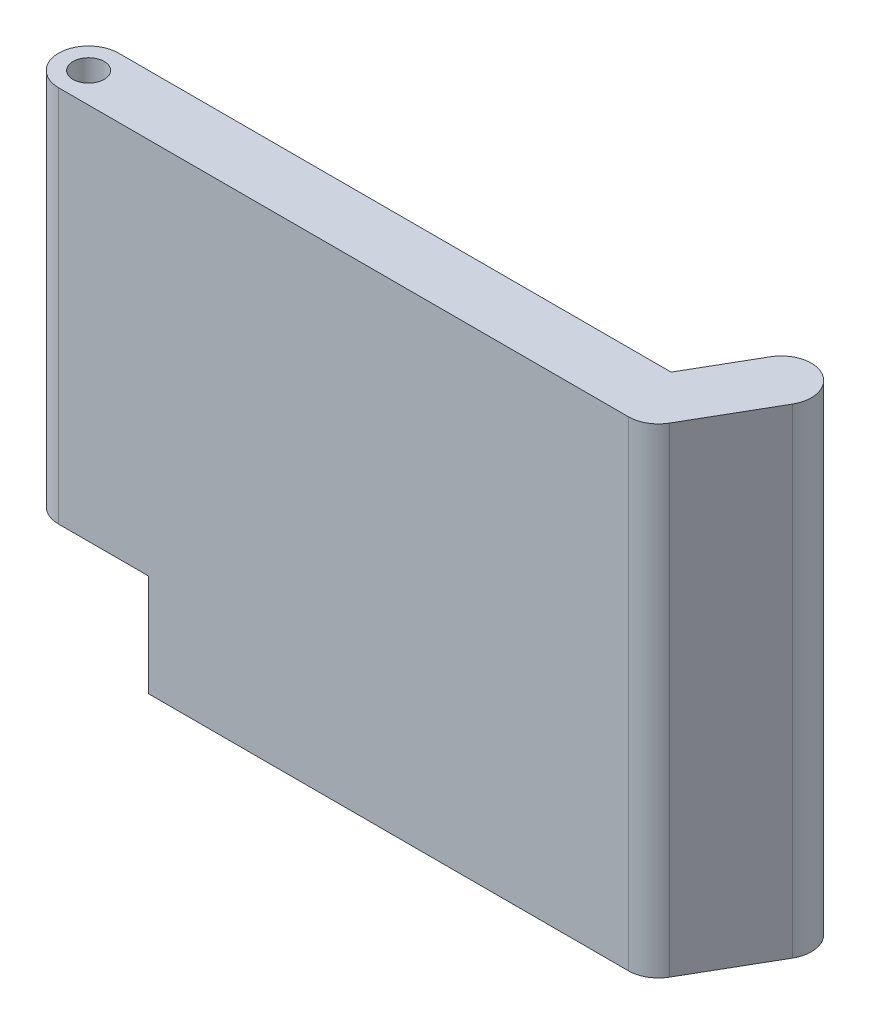
ISO-10303-21;
HEADER;
FILE_DESCRIPTION(('STEP AP214'),'2;1');
FILE_NAME('part.step','',(''),(''),'','','');
FILE_SCHEMA(('AUTOMOTIVE_DESIGN { 1 0 10303 214 1 1 1 1 }'));
ENDSEC;
DATA;
#1=APPLICATION_CONTEXT('core data for automotive mechanical design processes');
#2=APPLICATION_PROTOCOL_DEFINITION('international standard','automotive_design',2000,#1);
#3=PRODUCT_CONTEXT('',#1,'mechanical');
#4=PRODUCT('Part','Part','',(#3));
#5=PRODUCT_RELATED_PRODUCT_CATEGORY('part','',(#4));
#6=PRODUCT_DEFINITION_FORMATION('','',#4);
#7=PRODUCT_DEFINITION_CONTEXT('part definition',#1,'design');
#8=PRODUCT_DEFINITION('design','',#6,#7);
#9=PRODUCT_DEFINITION_SHAPE('','',#8);
#10=(LENGTH_UNIT() NAMED_UNIT(*) SI_UNIT(.MILLI.,.METRE.));
#11=(NAMED_UNIT(*) PLANE_ANGLE_UNIT() SI_UNIT($,.RADIAN.));
#12=(NAMED_UNIT(*) SI_UNIT($,.STERADIAN.) SOLID_ANGLE_UNIT());
#13=UNCERTAINTY_MEASURE_WITH_UNIT(LENGTH_MEASURE(1.E-05),#10,'distance_accuracy_value','');
#14=(GEOMETRIC_REPRESENTATION_CONTEXT(3) GLOBAL_UNCERTAINTY_ASSIGNED_CONTEXT((#13)) GLOBAL_UNIT_ASSIGNED_CONTEXT((#10,
#11,#12)) REPRESENTATION_CONTEXT('',''));
#15=CARTESIAN_POINT('',(0.,0.,0.));
#16=DIRECTION('',(0.,0.,1.));
#17=DIRECTION('',(1.,0.,0.));
#18=AXIS2_PLACEMENT_3D('',#15,#16,#17);
#19=CARTESIAN_POINT('',(0.,101.6,6.35));
#20=DIRECTION('',(0.,0.,-1.));
#21=DIRECTION('',(-1.,0.,0.));
#22=AXIS2_PLACEMENT_3D('',#19,#20,#21);
#23=PLANE('',#22);
#24=DIRECTION('',(0.,-1.,0.));
#25=VECTOR('',#24,1.);
#26=CARTESIAN_POINT('',(0.,101.6,6.35));
#27=LINE('',#26,#25);
#28=CARTESIAN_POINT('',(0.,101.6,6.35));
#29=VERTEX_POINT('',#28);
#30=CARTESIAN_POINT('',(0.,21.59,6.35));
#31=VERTEX_POINT('',#30);
#32=EDGE_CURVE('E137',#29,#31,#27,.T.);
#33=ORIENTED_EDGE('',*,*,#32,.T.);
#34=DIRECTION('',(-1.,0.,0.));
#35=VECTOR('',#34,1.);
#36=CARTESIAN_POINT('',(-6.35,21.59,6.35));
#37=LINE('',#36,#35);
#38=CARTESIAN_POINT('',(19.05,21.59,6.35));
#39=VERTEX_POINT('',#38);
#40=EDGE_CURVE('E195',#39,#31,#37,.T.);
#41=ORIENTED_EDGE('',*,*,#40,.F.);
#42=DIRECTION('',(0.,1.,0.));
#43=VECTOR('',#42,1.);
#44=CARTESIAN_POINT('',(19.05,21.59,6.35));
#45=LINE('',#44,#43);
#46=CARTESIAN_POINT('',(19.05,0.,6.35));
#47=VERTEX_POINT('',#46);
#48=EDGE_CURVE('E171',#47,#39,#45,.T.);
#49=ORIENTED_EDGE('',*,*,#48,.F.);
#50=DIRECTION('',(1.,0.,0.));
#51=VECTOR('',#50,1.);
#52=CARTESIAN_POINT('',(0.,0.,6.35));
#53=LINE('',#52,#51);
#54=CARTESIAN_POINT('',(120.65,0.,6.35));
#55=VERTEX_POINT('',#54);
#56=EDGE_CURVE('E138',#47,#55,#53,.T.);
#57=ORIENTED_EDGE('',*,*,#56,.T.);
#58=DIRECTION('',(0.,-1.,0.));
#59=VECTOR('',#58,1.);
#60=CARTESIAN_POINT('',(120.65,101.6,6.35));
#61=LINE('',#60,#59);
#62=CARTESIAN_POINT('',(120.65,101.6,6.35));
#63=VERTEX_POINT('',#62);
#64=EDGE_CURVE('E47',#63,#55,#61,.T.);
#65=ORIENTED_EDGE('',*,*,#64,.F.);
#66=DIRECTION('',(1.,0.,0.));
#67=VECTOR('',#66,1.);
#68=CARTESIAN_POINT('',(0.,101.6,6.35));
#69=LINE('',#68,#67);
#70=EDGE_CURVE('E150',#29,#63,#69,.T.);
#71=ORIENTED_EDGE('',*,*,#70,.F.);
#72=EDGE_LOOP('',(#33,#41,#49,#57,#65,#71));
#73=FACE_BOUND('',#72,.T.);
#74=ADVANCED_FACE('F39',(#73),#23,.F.);
#75=CARTESIAN_POINT('',(120.65,101.6,0.));
#76=DIRECTION('',(0.,-1.,0.));
#77=DIRECTION('',(0.,0.,-1.));
#78=AXIS2_PLACEMENT_3D('',#75,#76,#77);
#79=CYLINDRICAL_SURFACE('',#78,6.35000000000001);
#80=CARTESIAN_POINT('',(120.65,0.,0.));
#81=DIRECTION('',(0.,1.,0.));
#82=DIRECTION('',(0.,0.,1.));
#83=AXIS2_PLACEMENT_3D('',#80,#81,#82);
#84=CIRCLE('',#83,6.35000000000001);
#85=CARTESIAN_POINT('',(126.149261314031,0.,3.17499999999999));
#86=VERTEX_POINT('',#85);
#87=EDGE_CURVE('E140',#55,#86,#84,.T.);
#88=ORIENTED_EDGE('',*,*,#87,.T.);
#89=DIRECTION('',(0.,-1.,0.));
#90=VECTOR('',#89,1.);
#91=CARTESIAN_POINT('',(126.149261314031,101.6,3.17499999999999));
#92=LINE('',#91,#90);
#93=CARTESIAN_POINT('',(126.149261314031,101.6,3.17499999999999));
#94=VERTEX_POINT('',#93);
#95=EDGE_CURVE('E158',#94,#86,#92,.T.);
#96=ORIENTED_EDGE('',*,*,#95,.F.);
#97=CARTESIAN_POINT('',(120.65,101.6,0.));
#98=DIRECTION('',(0.,1.,0.));
#99=DIRECTION('',(0.,0.,1.));
#100=AXIS2_PLACEMENT_3D('',#97,#98,#99);
#101=CIRCLE('',#100,6.35000000000001);
#102=EDGE_CURVE('E96',#63,#94,#101,.T.);
#103=ORIENTED_EDGE('',*,*,#102,.F.);
#104=ORIENTED_EDGE('',*,*,#64,.T.);
#105=EDGE_LOOP('',(#88,#96,#103,#104));
#106=FACE_BOUND('',#105,.T.);
#107=ADVANCED_FACE('F162',(#106),#79,.T.);
#108=CARTESIAN_POINT('',(95.9867613140316,101.6,55.417982483296));
#109=DIRECTION('',(-0.86602540378444,0.,-0.499999999999997));
#110=DIRECTION('',(-0.499999999999997,0.,0.86602540378444));
#111=AXIS2_PLACEMENT_3D('',#108,#109,#110);
#112=PLANE('',#111);
#113=DIRECTION('',(0.499999999999997,0.,-0.86602540378444));
#114=VECTOR('',#113,1.);
#115=CARTESIAN_POINT('',(95.9867613140316,0.,55.417982483296));
#116=LINE('',#115,#114);
#117=CARTESIAN_POINT('',(135.674261314031,0.,-13.3227839420936));
#118=VERTEX_POINT('',#117);
#119=EDGE_CURVE('E143',#86,#118,#116,.T.);
#120=ORIENTED_EDGE('',*,*,#119,.T.);
#121=DIRECTION('',(0.,-1.,0.));
#122=VECTOR('',#121,1.);
#123=CARTESIAN_POINT('',(135.674261314031,101.6,-13.3227839420936));
#124=LINE('',#123,#122);
#125=CARTESIAN_POINT('',(135.674261314031,101.6,-13.3227839420936));
#126=VERTEX_POINT('',#125);
#127=EDGE_CURVE('E155',#126,#118,#124,.T.);
#128=ORIENTED_EDGE('',*,*,#127,.F.);
#129=DIRECTION('',(0.499999999999997,0.,-0.86602540378444));
#130=VECTOR('',#129,1.);
#131=CARTESIAN_POINT('',(95.9867613140316,101.6,55.417982483296));
#132=LINE('',#131,#130);
#133=EDGE_CURVE('E181',#94,#126,#132,.T.);
#134=ORIENTED_EDGE('',*,*,#133,.F.);
#135=ORIENTED_EDGE('',*,*,#95,.T.);
#136=EDGE_LOOP('',(#120,#128,#134,#135));
#137=FACE_BOUND('',#136,.T.);
#138=ADVANCED_FACE('F177',(#137),#112,.F.);
#139=CARTESIAN_POINT('',(130.175,101.6,-16.4977839420936));
#140=DIRECTION('',(0.,-1.,0.));
#141=DIRECTION('',(0.,0.,-1.));
#142=AXIS2_PLACEMENT_3D('',#139,#140,#141);
#143=CYLINDRICAL_SURFACE('',#142,6.35);
#144=CARTESIAN_POINT('',(130.175,0.,-16.4977839420936));
#145=DIRECTION('',(0.,1.,0.));
#146=DIRECTION('',(0.,0.,1.));
#147=AXIS2_PLACEMENT_3D('',#144,#145,#146);
#148=CIRCLE('',#147,6.35);
#149=CARTESIAN_POINT('',(124.675738685969,0.,-19.6727839420936));
#150=VERTEX_POINT('',#149);
#151=EDGE_CURVE('E145',#118,#150,#148,.T.);
#152=ORIENTED_EDGE('',*,*,#151,.T.);
#153=DIRECTION('',(0.,-1.,0.));
#154=VECTOR('',#153,1.);
#155=CARTESIAN_POINT('',(124.675738685969,101.6,-19.6727839420936));
#156=LINE('',#155,#154);
#157=CARTESIAN_POINT('',(124.675738685969,101.6,-19.6727839420936));
#158=VERTEX_POINT('',#157);
#159=EDGE_CURVE('E117',#158,#150,#156,.T.);
#160=ORIENTED_EDGE('',*,*,#159,.F.);
#161=CARTESIAN_POINT('',(130.175,101.6,-16.4977839420936));
#162=DIRECTION('',(0.,1.,0.));
#163=DIRECTION('',(0.,0.,1.));
#164=AXIS2_PLACEMENT_3D('',#161,#162,#163);
#165=CIRCLE('',#164,6.35);
#166=EDGE_CURVE('E124',#126,#158,#165,.T.);
#167=ORIENTED_EDGE('',*,*,#166,.F.);
#168=ORIENTED_EDGE('',*,*,#127,.T.);
#169=EDGE_LOOP('',(#152,#160,#167,#168));
#170=FACE_BOUND('',#169,.T.);
#171=ADVANCED_FACE('F180',(#170),#143,.T.);
#172=CARTESIAN_POINT('',(84.9882386859691,101.6,49.0679824832961));
#173=DIRECTION('',(-0.86602540378444,0.,-0.499999999999997));
#174=DIRECTION('',(-0.499999999999998,0.,0.86602540378444));
#175=AXIS2_PLACEMENT_3D('',#172,#173,#174);
#176=PLANE('',#175);
#177=DIRECTION('',(0.499999999999997,0.,-0.86602540378444));
#178=VECTOR('',#177,1.);
#179=CARTESIAN_POINT('',(84.9882386859691,0.,49.0679824832961));
#180=LINE('',#179,#178);
#181=CARTESIAN_POINT('',(116.983825790646,0.,-6.35));
#182=VERTEX_POINT('',#181);
#183=EDGE_CURVE('E114',#182,#150,#180,.T.);
#184=ORIENTED_EDGE('',*,*,#183,.F.);
#185=DIRECTION('',(0.,-1.,0.));
#186=VECTOR('',#185,1.);
#187=CARTESIAN_POINT('',(116.983825790646,101.6,-6.35));
#188=LINE('',#187,#186);
#189=CARTESIAN_POINT('',(116.983825790646,101.6,-6.35));
#190=VERTEX_POINT('',#189);
#191=EDGE_CURVE('E110',#190,#182,#188,.T.);
#192=ORIENTED_EDGE('',*,*,#191,.F.);
#193=DIRECTION('',(0.499999999999997,0.,-0.86602540378444));
#194=VECTOR('',#193,1.);
#195=CARTESIAN_POINT('',(84.9882386859691,101.6,49.0679824832961));
#196=LINE('',#195,#194);
#197=EDGE_CURVE('E113',#190,#158,#196,.T.);
#198=ORIENTED_EDGE('',*,*,#197,.T.);
#199=ORIENTED_EDGE('',*,*,#159,.T.);
#200=EDGE_LOOP('',(#184,#192,#198,#199));
#201=FACE_BOUND('',#200,.T.);
#202=ADVANCED_FACE('F112',(#201),#176,.T.);
#203=CARTESIAN_POINT('',(0.,101.6,-6.35));
#204=DIRECTION('',(0.,0.,-1.));
#205=DIRECTION('',(-1.,0.,0.));
#206=AXIS2_PLACEMENT_3D('',#203,#204,#205);
#207=PLANE('',#206);
#208=DIRECTION('',(1.,0.,0.));
#209=VECTOR('',#208,1.);
#210=CARTESIAN_POINT('',(0.,21.59,-6.35));
#211=LINE('',#210,#209);
#212=CARTESIAN_POINT('',(0.,21.59,-6.35));
#213=VERTEX_POINT('',#212);
#214=CARTESIAN_POINT('',(19.05,21.59,-6.35));
#215=VERTEX_POINT('',#214);
#216=EDGE_CURVE('E141',#213,#215,#211,.T.);
#217=ORIENTED_EDGE('',*,*,#216,.F.);
#218=DIRECTION('',(0.,-1.,0.));
#219=VECTOR('',#218,1.);
#220=CARTESIAN_POINT('',(0.,101.6,-6.35));
#221=LINE('',#220,#219);
#222=CARTESIAN_POINT('',(0.,101.6,-6.35));
#223=VERTEX_POINT('',#222);
#224=EDGE_CURVE('E118',#223,#213,#221,.T.);
#225=ORIENTED_EDGE('',*,*,#224,.F.);
#226=DIRECTION('',(1.,0.,0.));
#227=VECTOR('',#226,1.);
#228=CARTESIAN_POINT('',(0.,101.6,-6.35));
#229=LINE('',#228,#227);
#230=EDGE_CURVE('E122',#223,#190,#229,.T.);
#231=ORIENTED_EDGE('',*,*,#230,.T.);
#232=ORIENTED_EDGE('',*,*,#191,.T.);
#233=DIRECTION('',(1.,0.,0.));
#234=VECTOR('',#233,1.);
#235=CARTESIAN_POINT('',(0.,0.,-6.35));
#236=LINE('',#235,#234);
#237=CARTESIAN_POINT('',(19.05,0.,-6.35));
#238=VERTEX_POINT('',#237);
#239=EDGE_CURVE('E87',#238,#182,#236,.T.);
#240=ORIENTED_EDGE('',*,*,#239,.F.);
#241=DIRECTION('',(0.,-1.,0.));
#242=VECTOR('',#241,1.);
#243=CARTESIAN_POINT('',(19.05,101.6,-6.35));
#244=LINE('',#243,#242);
#245=EDGE_CURVE('E54',#215,#238,#244,.T.);
#246=ORIENTED_EDGE('',*,*,#245,.F.);
#247=EDGE_LOOP('',(#217,#225,#231,#232,#240,#246));
#248=FACE_BOUND('',#247,.T.);
#249=ADVANCED_FACE('F128',(#248),#207,.T.);
#250=CARTESIAN_POINT('',(0.,101.6,0.));
#251=DIRECTION('',(0.,-1.,0.));
#252=DIRECTION('',(0.,0.,-1.));
#253=AXIS2_PLACEMENT_3D('',#250,#251,#252);
#254=CYLINDRICAL_SURFACE('',#253,6.35);
#255=ORIENTED_EDGE('',*,*,#224,.T.);
#256=CARTESIAN_POINT('',(0.,21.59,0.));
#257=DIRECTION('',(0.,1.,0.));
#258=DIRECTION('',(0.,0.,1.));
#259=AXIS2_PLACEMENT_3D('',#256,#257,#258);
#260=CIRCLE('',#259,6.35);
#261=EDGE_CURVE('E188',#213,#31,#260,.T.);
#262=ORIENTED_EDGE('',*,*,#261,.T.);
#263=ORIENTED_EDGE('',*,*,#32,.F.);
#264=CARTESIAN_POINT('',(0.,101.6,0.));
#265=DIRECTION('',(0.,1.,0.));
#266=DIRECTION('',(0.,0.,1.));
#267=AXIS2_PLACEMENT_3D('',#264,#265,#266);
#268=CIRCLE('',#267,6.35);
#269=EDGE_CURVE('E62',#223,#29,#268,.T.);
#270=ORIENTED_EDGE('',*,*,#269,.F.);
#271=EDGE_LOOP('',(#255,#262,#263,#270));
#272=FACE_BOUND('',#271,.T.);
#273=ADVANCED_FACE('F210',(#272),#254,.T.);
#274=CARTESIAN_POINT('',(0.,101.6,0.));
#275=DIRECTION('',(0.,-1.,0.));
#276=DIRECTION('',(0.,0.,-1.));
#277=AXIS2_PLACEMENT_3D('',#274,#275,#276);
#278=CYLINDRICAL_SURFACE('',#277,3.302);
#279=CARTESIAN_POINT('',(0.,21.59,0.));
#280=DIRECTION('',(0.,1.,0.));
#281=DIRECTION('',(0.,0.,1.));
#282=AXIS2_PLACEMENT_3D('',#279,#280,#281);
#283=CIRCLE('',#282,3.302);
#284=CARTESIAN_POINT('',(0.,21.59,3.302));
#285=VERTEX_POINT('',#284);
#286=EDGE_CURVE('E42',#285,#285,#283,.T.);
#287=ORIENTED_EDGE('',*,*,#286,.F.);
#288=EDGE_LOOP('',(#287));
#289=FACE_BOUND('',#288,.T.);
#290=CARTESIAN_POINT('',(0.,101.6,0.));
#291=DIRECTION('',(0.,1.,0.));
#292=DIRECTION('',(0.,0.,1.));
#293=AXIS2_PLACEMENT_3D('',#290,#291,#292);
#294=CIRCLE('',#293,3.302);
#295=CARTESIAN_POINT('',(0.,101.6,3.302));
#296=VERTEX_POINT('',#295);
#297=EDGE_CURVE('E131',#296,#296,#294,.T.);
#298=ORIENTED_EDGE('',*,*,#297,.T.);
#299=EDGE_LOOP('',(#298));
#300=FACE_BOUND('',#299,.T.);
#301=ADVANCED_FACE('F212',(#289,#300),#278,.F.);
#302=CARTESIAN_POINT('',(0.,101.6,0.));
#303=DIRECTION('',(0.,1.,0.));
#304=DIRECTION('',(0.,0.,1.));
#305=AXIS2_PLACEMENT_3D('',#302,#303,#304);
#306=PLANE('',#305);
#307=ORIENTED_EDGE('',*,*,#70,.T.);
#308=ORIENTED_EDGE('',*,*,#102,.T.);
#309=ORIENTED_EDGE('',*,*,#133,.T.);
#310=ORIENTED_EDGE('',*,*,#166,.T.);
#311=ORIENTED_EDGE('',*,*,#197,.F.);
#312=ORIENTED_EDGE('',*,*,#230,.F.);
#313=ORIENTED_EDGE('',*,*,#269,.T.);
#314=EDGE_LOOP('',(#307,#308,#309,#310,#311,#312,#313));
#315=FACE_BOUND('',#314,.T.);
#316=ORIENTED_EDGE('',*,*,#297,.F.);
#317=EDGE_LOOP('',(#316));
#318=FACE_BOUND('',#317,.T.);
#319=ADVANCED_FACE('F120',(#315,#318),#306,.T.);
#320=CARTESIAN_POINT('',(0.,0.,0.));
#321=DIRECTION('',(0.,1.,0.));
#322=DIRECTION('',(0.,0.,1.));
#323=AXIS2_PLACEMENT_3D('',#320,#321,#322);
#324=PLANE('',#323);
#325=ORIENTED_EDGE('',*,*,#56,.F.);
#326=DIRECTION('',(0.,0.,-1.));
#327=VECTOR('',#326,1.);
#328=CARTESIAN_POINT('',(19.05,0.,0.));
#329=LINE('',#328,#327);
#330=EDGE_CURVE('E11',#47,#238,#329,.T.);
#331=ORIENTED_EDGE('',*,*,#330,.T.);
#332=ORIENTED_EDGE('',*,*,#239,.T.);
#333=ORIENTED_EDGE('',*,*,#183,.T.);
#334=ORIENTED_EDGE('',*,*,#151,.F.);
#335=ORIENTED_EDGE('',*,*,#119,.F.);
#336=ORIENTED_EDGE('',*,*,#87,.F.);
#337=EDGE_LOOP('',(#325,#331,#332,#333,#334,#335,#336));
#338=FACE_BOUND('',#337,.T.);
#339=ADVANCED_FACE('F173',(#338),#324,.F.);
#340=CARTESIAN_POINT('',(-6.35,21.59,-22.8477839420936));
#341=DIRECTION('',(0.,1.,0.));
#342=DIRECTION('',(0.,0.,1.));
#343=AXIS2_PLACEMENT_3D('',#340,#341,#342);
#344=PLANE('',#343);
#345=ORIENTED_EDGE('',*,*,#216,.T.);
#346=DIRECTION('',(0.,0.,1.));
#347=VECTOR('',#346,1.);
#348=CARTESIAN_POINT('',(19.05,21.59,-22.8477839420936));
#349=LINE('',#348,#347);
#350=EDGE_CURVE('E192',#215,#39,#349,.T.);
#351=ORIENTED_EDGE('',*,*,#350,.T.);
#352=ORIENTED_EDGE('',*,*,#40,.T.);
#353=ORIENTED_EDGE('',*,*,#261,.F.);
#354=EDGE_LOOP('',(#345,#351,#352,#353));
#355=FACE_BOUND('',#354,.T.);
#356=ORIENTED_EDGE('',*,*,#286,.T.);
#357=EDGE_LOOP('',(#356));
#358=FACE_BOUND('',#357,.T.);
#359=ADVANCED_FACE('F205',(#355,#358),#344,.F.);
#360=CARTESIAN_POINT('',(19.05,21.59,-22.8477839420936));
#361=DIRECTION('',(1.,0.,0.));
#362=DIRECTION('',(0.,1.,0.));
#363=AXIS2_PLACEMENT_3D('',#360,#361,#362);
#364=PLANE('',#363);
#365=ORIENTED_EDGE('',*,*,#245,.T.);
#366=ORIENTED_EDGE('',*,*,#330,.F.);
#367=ORIENTED_EDGE('',*,*,#48,.T.);
#368=ORIENTED_EDGE('',*,*,#350,.F.);
#369=EDGE_LOOP('',(#365,#366,#367,#368));
#370=FACE_BOUND('',#369,.T.);
#371=ADVANCED_FACE('F199',(#370),#364,.F.);
#372=CLOSED_SHELL('',(#74,#107,#138,#171,#202,#249,#273,#301,#319,#339,#359,#371));
#373=MANIFOLD_SOLID_BREP('B2',#372);
#374=ADVANCED_BREP_SHAPE_REPRESENTATION('',(#18,#373),#14);
#375=SHAPE_DEFINITION_REPRESENTATION(#9,#374);
ENDSEC;
END-ISO-10303-21;
